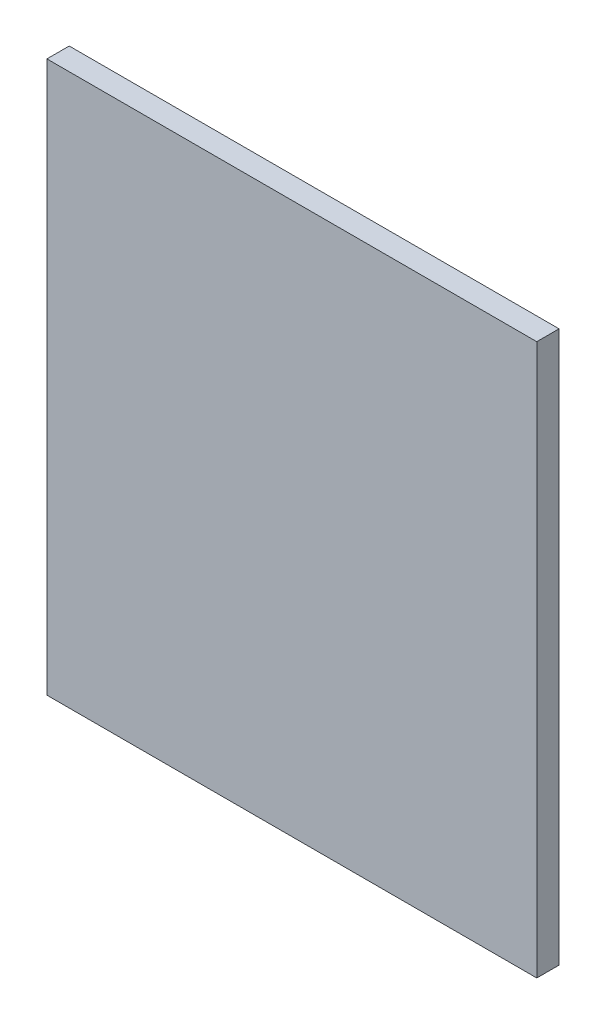
ISO-10303-21;
HEADER;
FILE_DESCRIPTION(('STEP AP214'),'2;1');
FILE_NAME('part.step','',(''),(''),'','','');
FILE_SCHEMA(('AUTOMOTIVE_DESIGN { 1 0 10303 214 1 1 1 1 }'));
ENDSEC;
DATA;
#1=APPLICATION_CONTEXT('core data for automotive mechanical design processes');
#2=APPLICATION_PROTOCOL_DEFINITION('international standard','automotive_design',2000,#1);
#3=PRODUCT_CONTEXT('',#1,'mechanical');
#4=PRODUCT('Part','Part','',(#3));
#5=PRODUCT_RELATED_PRODUCT_CATEGORY('part','',(#4));
#6=PRODUCT_DEFINITION_FORMATION('','',#4);
#7=PRODUCT_DEFINITION_CONTEXT('part definition',#1,'design');
#8=PRODUCT_DEFINITION('design','',#6,#7);
#9=PRODUCT_DEFINITION_SHAPE('','',#8);
#10=(LENGTH_UNIT() NAMED_UNIT(*) SI_UNIT(.MILLI.,.METRE.));
#11=(NAMED_UNIT(*) PLANE_ANGLE_UNIT() SI_UNIT($,.RADIAN.));
#12=(NAMED_UNIT(*) SI_UNIT($,.STERADIAN.) SOLID_ANGLE_UNIT());
#13=UNCERTAINTY_MEASURE_WITH_UNIT(LENGTH_MEASURE(1.E-05),#10,'distance_accuracy_value','');
#14=(GEOMETRIC_REPRESENTATION_CONTEXT(3) GLOBAL_UNCERTAINTY_ASSIGNED_CONTEXT((#13)) GLOBAL_UNIT_ASSIGNED_CONTEXT((#10,
#11,#12)) REPRESENTATION_CONTEXT('',''));
#15=CARTESIAN_POINT('',(0.,0.,0.));
#16=DIRECTION('',(0.,0.,1.));
#17=DIRECTION('',(1.,0.,0.));
#18=AXIS2_PLACEMENT_3D('',#15,#16,#17);
#19=CARTESIAN_POINT('',(-15.1392405063291,11.7822784810127,1.42));
#20=DIRECTION('',(1.,0.,0.));
#21=DIRECTION('',(0.,1.,0.));
#22=AXIS2_PLACEMENT_3D('',#19,#20,#21);
#23=PLANE('',#22);
#24=DIRECTION('',(0.,-1.,0.));
#25=VECTOR('',#24,1.);
#26=CARTESIAN_POINT('',(-15.1392405063291,11.7822784810127,0.));
#27=LINE('',#26,#25);
#28=CARTESIAN_POINT('',(-15.1392405063291,11.7822784810127,0.));
#29=VERTEX_POINT('',#28);
#30=CARTESIAN_POINT('',(-15.1392405063291,-23.3177215189873,0.));
#31=VERTEX_POINT('',#30);
#32=EDGE_CURVE('E99',#29,#31,#27,.T.);
#33=ORIENTED_EDGE('',*,*,#32,.T.);
#34=DIRECTION('',(0.,0.,-1.));
#35=VECTOR('',#34,1.);
#36=CARTESIAN_POINT('',(-15.1392405063291,-23.3177215189873,1.42));
#37=LINE('',#36,#35);
#38=CARTESIAN_POINT('',(-15.1392405063291,-23.3177215189873,1.42));
#39=VERTEX_POINT('',#38);
#40=EDGE_CURVE('E11',#39,#31,#37,.T.);
#41=ORIENTED_EDGE('',*,*,#40,.F.);
#42=DIRECTION('',(0.,-1.,0.));
#43=VECTOR('',#42,1.);
#44=CARTESIAN_POINT('',(-15.1392405063291,11.7822784810127,1.42));
#45=LINE('',#44,#43);
#46=CARTESIAN_POINT('',(-15.1392405063291,11.7822784810127,1.42));
#47=VERTEX_POINT('',#46);
#48=EDGE_CURVE('E85',#47,#39,#45,.T.);
#49=ORIENTED_EDGE('',*,*,#48,.F.);
#50=DIRECTION('',(0.,0.,-1.));
#51=VECTOR('',#50,1.);
#52=CARTESIAN_POINT('',(-15.1392405063291,11.7822784810127,1.42));
#53=LINE('',#52,#51);
#54=EDGE_CURVE('E52',#47,#29,#53,.T.);
#55=ORIENTED_EDGE('',*,*,#54,.T.);
#56=EDGE_LOOP('',(#33,#41,#49,#55));
#57=FACE_BOUND('',#56,.T.);
#58=ADVANCED_FACE('F36',(#57),#23,.F.);
#59=CARTESIAN_POINT('',(-15.1392405063291,-23.3177215189873,1.42));
#60=DIRECTION('',(0.,1.,0.));
#61=DIRECTION('',(0.,0.,1.));
#62=AXIS2_PLACEMENT_3D('',#59,#60,#61);
#63=PLANE('',#62);
#64=DIRECTION('',(1.,0.,0.));
#65=VECTOR('',#64,1.);
#66=CARTESIAN_POINT('',(-15.1392405063291,-23.3177215189873,0.));
#67=LINE('',#66,#65);
#68=CARTESIAN_POINT('',(16.0607594936709,-23.3177215189873,0.));
#69=VERTEX_POINT('',#68);
#70=EDGE_CURVE('E90',#31,#69,#67,.T.);
#71=ORIENTED_EDGE('',*,*,#70,.T.);
#72=DIRECTION('',(0.,0.,-1.));
#73=VECTOR('',#72,1.);
#74=CARTESIAN_POINT('',(16.0607594936709,-23.3177215189873,1.42));
#75=LINE('',#74,#73);
#76=CARTESIAN_POINT('',(16.0607594936709,-23.3177215189873,1.42));
#77=VERTEX_POINT('',#76);
#78=EDGE_CURVE('E44',#77,#69,#75,.T.);
#79=ORIENTED_EDGE('',*,*,#78,.F.);
#80=DIRECTION('',(1.,0.,0.));
#81=VECTOR('',#80,1.);
#82=CARTESIAN_POINT('',(-15.1392405063291,-23.3177215189873,1.42));
#83=LINE('',#82,#81);
#84=EDGE_CURVE('E77',#39,#77,#83,.T.);
#85=ORIENTED_EDGE('',*,*,#84,.F.);
#86=ORIENTED_EDGE('',*,*,#40,.T.);
#87=EDGE_LOOP('',(#71,#79,#85,#86));
#88=FACE_BOUND('',#87,.T.);
#89=ADVANCED_FACE('F89',(#88),#63,.F.);
#90=CARTESIAN_POINT('',(16.0607594936709,11.7822784810127,1.42));
#91=DIRECTION('',(1.,0.,0.));
#92=DIRECTION('',(0.,1.,0.));
#93=AXIS2_PLACEMENT_3D('',#90,#91,#92);
#94=PLANE('',#93);
#95=DIRECTION('',(0.,-1.,0.));
#96=VECTOR('',#95,1.);
#97=CARTESIAN_POINT('',(16.0607594936709,11.7822784810127,0.));
#98=LINE('',#97,#96);
#99=CARTESIAN_POINT('',(16.0607594936709,11.7822784810127,0.));
#100=VERTEX_POINT('',#99);
#101=EDGE_CURVE('E102',#100,#69,#98,.T.);
#102=ORIENTED_EDGE('',*,*,#101,.F.);
#103=DIRECTION('',(0.,0.,-1.));
#104=VECTOR('',#103,1.);
#105=CARTESIAN_POINT('',(16.0607594936709,11.7822784810127,1.42));
#106=LINE('',#105,#104);
#107=CARTESIAN_POINT('',(16.0607594936709,11.7822784810127,1.42));
#108=VERTEX_POINT('',#107);
#109=EDGE_CURVE('E66',#108,#100,#106,.T.);
#110=ORIENTED_EDGE('',*,*,#109,.F.);
#111=DIRECTION('',(0.,-1.,0.));
#112=VECTOR('',#111,1.);
#113=CARTESIAN_POINT('',(16.0607594936709,11.7822784810127,1.42));
#114=LINE('',#113,#112);
#115=EDGE_CURVE('E84',#108,#77,#114,.T.);
#116=ORIENTED_EDGE('',*,*,#115,.T.);
#117=ORIENTED_EDGE('',*,*,#78,.T.);
#118=EDGE_LOOP('',(#102,#110,#116,#117));
#119=FACE_BOUND('',#118,.T.);
#120=ADVANCED_FACE('F93',(#119),#94,.T.);
#121=CARTESIAN_POINT('',(-15.1392405063291,11.7822784810127,1.42));
#122=DIRECTION('',(0.,1.,0.));
#123=DIRECTION('',(0.,0.,1.));
#124=AXIS2_PLACEMENT_3D('',#121,#122,#123);
#125=PLANE('',#124);
#126=DIRECTION('',(1.,0.,0.));
#127=VECTOR('',#126,1.);
#128=CARTESIAN_POINT('',(-15.1392405063291,11.7822784810127,0.));
#129=LINE('',#128,#127);
#130=EDGE_CURVE('E104',#29,#100,#129,.T.);
#131=ORIENTED_EDGE('',*,*,#130,.F.);
#132=ORIENTED_EDGE('',*,*,#54,.F.);
#133=DIRECTION('',(1.,0.,0.));
#134=VECTOR('',#133,1.);
#135=CARTESIAN_POINT('',(-15.1392405063291,11.7822784810127,1.42));
#136=LINE('',#135,#134);
#137=EDGE_CURVE('E94',#47,#108,#136,.T.);
#138=ORIENTED_EDGE('',*,*,#137,.T.);
#139=ORIENTED_EDGE('',*,*,#109,.T.);
#140=EDGE_LOOP('',(#131,#132,#138,#139));
#141=FACE_BOUND('',#140,.T.);
#142=ADVANCED_FACE('F110',(#141),#125,.T.);
#143=CARTESIAN_POINT('',(0.,0.,1.42));
#144=DIRECTION('',(0.,0.,1.));
#145=DIRECTION('',(1.,0.,0.));
#146=AXIS2_PLACEMENT_3D('',#143,#144,#145);
#147=PLANE('',#146);
#148=ORIENTED_EDGE('',*,*,#48,.T.);
#149=ORIENTED_EDGE('',*,*,#84,.T.);
#150=ORIENTED_EDGE('',*,*,#115,.F.);
#151=ORIENTED_EDGE('',*,*,#137,.F.);
#152=EDGE_LOOP('',(#148,#149,#150,#151));
#153=FACE_BOUND('',#152,.T.);
#154=ADVANCED_FACE('F81',(#153),#147,.T.);
#155=CARTESIAN_POINT('',(0.,0.,0.));
#156=DIRECTION('',(0.,0.,1.));
#157=DIRECTION('',(1.,0.,0.));
#158=AXIS2_PLACEMENT_3D('',#155,#156,#157);
#159=PLANE('',#158);
#160=ORIENTED_EDGE('',*,*,#32,.F.);
#161=ORIENTED_EDGE('',*,*,#130,.T.);
#162=ORIENTED_EDGE('',*,*,#101,.T.);
#163=ORIENTED_EDGE('',*,*,#70,.F.);
#164=EDGE_LOOP('',(#160,#161,#162,#163));
#165=FACE_BOUND('',#164,.T.);
#166=ADVANCED_FACE('F109',(#165),#159,.F.);
#167=CLOSED_SHELL('',(#58,#89,#120,#142,#154,#166));
#168=MANIFOLD_SOLID_BREP('B2',#167);
#169=ADVANCED_BREP_SHAPE_REPRESENTATION('',(#18,#168),#14);
#170=SHAPE_DEFINITION_REPRESENTATION(#9,#169);
ENDSEC;
END-ISO-10303-21;
